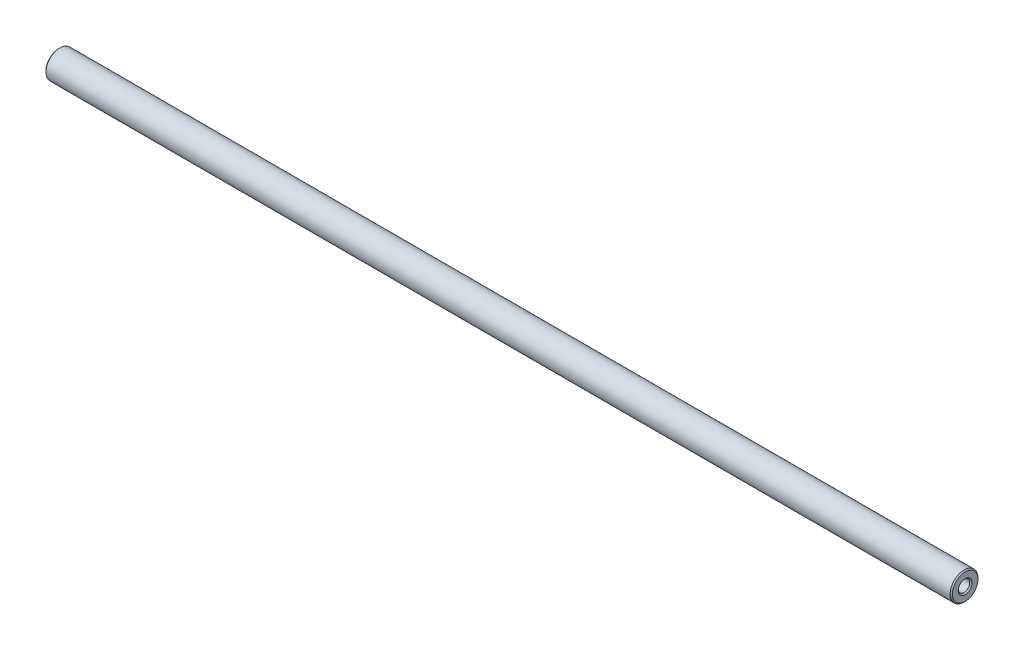
ISO-10303-21;
HEADER;
FILE_DESCRIPTION(('STEP AP214'),'2;1');
FILE_NAME('part.step','',(''),(''),'','','');
FILE_SCHEMA(('AUTOMOTIVE_DESIGN { 1 0 10303 214 1 1 1 1 }'));
ENDSEC;
DATA;
#1=APPLICATION_CONTEXT('core data for automotive mechanical design processes');
#2=APPLICATION_PROTOCOL_DEFINITION('international standard','automotive_design',2000,#1);
#3=PRODUCT_CONTEXT('',#1,'mechanical');
#4=PRODUCT('Part','Part','',(#3));
#5=PRODUCT_RELATED_PRODUCT_CATEGORY('part','',(#4));
#6=PRODUCT_DEFINITION_FORMATION('','',#4);
#7=PRODUCT_DEFINITION_CONTEXT('part definition',#1,'design');
#8=PRODUCT_DEFINITION('design','',#6,#7);
#9=PRODUCT_DEFINITION_SHAPE('','',#8);
#10=(LENGTH_UNIT() NAMED_UNIT(*) SI_UNIT(.MILLI.,.METRE.));
#11=(NAMED_UNIT(*) PLANE_ANGLE_UNIT() SI_UNIT($,.RADIAN.));
#12=(NAMED_UNIT(*) SI_UNIT($,.STERADIAN.) SOLID_ANGLE_UNIT());
#13=UNCERTAINTY_MEASURE_WITH_UNIT(LENGTH_MEASURE(1.E-05),#10,'distance_accuracy_value','');
#14=(GEOMETRIC_REPRESENTATION_CONTEXT(3) GLOBAL_UNCERTAINTY_ASSIGNED_CONTEXT((#13)) GLOBAL_UNIT_ASSIGNED_CONTEXT((#10,
#11,#12)) REPRESENTATION_CONTEXT('',''));
#15=CARTESIAN_POINT('',(0.,0.,0.));
#16=DIRECTION('',(0.,0.,1.));
#17=DIRECTION('',(1.,0.,0.));
#18=AXIS2_PLACEMENT_3D('',#15,#16,#17);
#19=CARTESIAN_POINT('',(0.,-5.5,5.5));
#20=DIRECTION('',(-1.,0.,0.));
#21=DIRECTION('',(0.,1.,0.));
#22=AXIS2_PLACEMENT_3D('',#19,#20,#21);
#23=PLANE('',#22);
#24=CARTESIAN_POINT('',(0.,0.,0.));
#25=DIRECTION('',(-1.,0.,0.));
#26=DIRECTION('',(0.,0.,-1.));
#27=AXIS2_PLACEMENT_3D('',#24,#25,#26);
#28=CIRCLE('',#27,5.5);
#29=CARTESIAN_POINT('',(0.,0.,-5.5));
#30=VERTEX_POINT('',#29);
#31=EDGE_CURVE('E117',#30,#30,#28,.F.);
#32=ORIENTED_EDGE('',*,*,#31,.F.);
#33=EDGE_LOOP('',(#32));
#34=FACE_BOUND('',#33,.T.);
#35=CARTESIAN_POINT('',(0.,0.,0.));
#36=DIRECTION('',(1.,0.,0.));
#37=DIRECTION('',(0.,0.,1.));
#38=AXIS2_PLACEMENT_3D('',#35,#36,#37);
#39=CIRCLE('',#38,3.);
#40=CARTESIAN_POINT('',(0.,0.,3.));
#41=VERTEX_POINT('',#40);
#42=EDGE_CURVE('E79',#41,#41,#39,.T.);
#43=ORIENTED_EDGE('',*,*,#42,.T.);
#44=EDGE_LOOP('',(#43));
#45=FACE_BOUND('',#44,.T.);
#46=ADVANCED_FACE('F16',(#34,#45),#23,.T.);
#47=CARTESIAN_POINT('',(390.,-5.5,-5.5));
#48=DIRECTION('',(1.,0.,0.));
#49=DIRECTION('',(0.,1.,0.));
#50=AXIS2_PLACEMENT_3D('',#47,#48,#49);
#51=PLANE('',#50);
#52=CARTESIAN_POINT('',(390.,0.,0.));
#53=DIRECTION('',(1.,0.,0.));
#54=DIRECTION('',(0.,0.,1.));
#55=AXIS2_PLACEMENT_3D('',#52,#53,#54);
#56=CIRCLE('',#55,5.5);
#57=CARTESIAN_POINT('',(390.,0.,5.5));
#58=VERTEX_POINT('',#57);
#59=EDGE_CURVE('E110',#58,#58,#56,.T.);
#60=ORIENTED_EDGE('',*,*,#59,.T.);
#61=EDGE_LOOP('',(#60));
#62=FACE_BOUND('',#61,.T.);
#63=CARTESIAN_POINT('',(390.,0.,0.));
#64=DIRECTION('',(-1.,0.,0.));
#65=DIRECTION('',(0.,0.,-1.));
#66=AXIS2_PLACEMENT_3D('',#63,#64,#65);
#67=CIRCLE('',#66,3.00000000000007);
#68=CARTESIAN_POINT('',(390.,0.,-3.00000000000007));
#69=VERTEX_POINT('',#68);
#70=EDGE_CURVE('E108',#69,#69,#67,.F.);
#71=ORIENTED_EDGE('',*,*,#70,.F.);
#72=EDGE_LOOP('',(#71));
#73=FACE_BOUND('',#72,.T.);
#74=ADVANCED_FACE('F49',(#62,#73),#51,.T.);
#75=CARTESIAN_POINT('',(0.500000000000002,0.,0.));
#76=DIRECTION('',(1.,0.,0.));
#77=DIRECTION('',(0.,1.92332050626273E-10,1.));
#78=AXIS2_PLACEMENT_3D('',#75,#76,#77);
#79=CONICAL_SURFACE('',#78,6.,0.785398163397448);
#80=CARTESIAN_POINT('',(0.500000000000002,0.,0.));
#81=DIRECTION('',(-1.,0.,0.));
#82=DIRECTION('',(0.,0.,-1.));
#83=AXIS2_PLACEMENT_3D('',#80,#81,#82);
#84=CIRCLE('',#83,6.);
#85=CARTESIAN_POINT('',(0.500000000000002,0.,-6.));
#86=VERTEX_POINT('',#85);
#87=EDGE_CURVE('E90',#86,#86,#84,.F.);
#88=ORIENTED_EDGE('',*,*,#87,.F.);
#89=EDGE_LOOP('',(#88));
#90=FACE_BOUND('',#89,.T.);
#91=ORIENTED_EDGE('',*,*,#31,.T.);
#92=EDGE_LOOP('',(#91));
#93=FACE_BOUND('',#92,.T.);
#94=ADVANCED_FACE('F55',(#90,#93),#79,.T.);
#95=CARTESIAN_POINT('',(390.,0.,0.));
#96=DIRECTION('',(1.,0.,0.));
#97=DIRECTION('',(0.,7.69327835111053E-10,1.));
#98=AXIS2_PLACEMENT_3D('',#95,#96,#97);
#99=CYLINDRICAL_SURFACE('',#98,6.);
#100=CARTESIAN_POINT('',(389.5,0.,0.));
#101=DIRECTION('',(-1.,0.,0.));
#102=DIRECTION('',(0.,0.,-1.));
#103=AXIS2_PLACEMENT_3D('',#100,#101,#102);
#104=CIRCLE('',#103,6.);
#105=CARTESIAN_POINT('',(389.5,0.,-6.));
#106=VERTEX_POINT('',#105);
#107=EDGE_CURVE('E85',#106,#106,#104,.F.);
#108=ORIENTED_EDGE('',*,*,#107,.F.);
#109=EDGE_LOOP('',(#108));
#110=FACE_BOUND('',#109,.T.);
#111=ORIENTED_EDGE('',*,*,#87,.T.);
#112=EDGE_LOOP('',(#111));
#113=FACE_BOUND('',#112,.T.);
#114=ADVANCED_FACE('F63',(#110,#113),#99,.T.);
#115=CARTESIAN_POINT('',(389.5,0.,0.));
#116=DIRECTION('',(-1.,0.,0.));
#117=DIRECTION('',(0.,0.,-1.));
#118=AXIS2_PLACEMENT_3D('',#115,#116,#117);
#119=CONICAL_SURFACE('',#118,6.,0.785398163397447);
#120=ORIENTED_EDGE('',*,*,#59,.F.);
#121=EDGE_LOOP('',(#120));
#122=FACE_BOUND('',#121,.T.);
#123=ORIENTED_EDGE('',*,*,#107,.T.);
#124=EDGE_LOOP('',(#123));
#125=FACE_BOUND('',#124,.T.);
#126=ADVANCED_FACE('F67',(#122,#125),#119,.T.);
#127=CARTESIAN_POINT('',(0.,0.,0.));
#128=DIRECTION('',(-1.,0.,0.));
#129=DIRECTION('',(0.,0.,-1.));
#130=AXIS2_PLACEMENT_3D('',#127,#128,#129);
#131=CONICAL_SURFACE('',#130,3.,0.785398163397448);
#132=ORIENTED_EDGE('',*,*,#42,.F.);
#133=EDGE_LOOP('',(#132));
#134=FACE_BOUND('',#133,.T.);
#135=CARTESIAN_POINT('',(0.541500000000001,0.,0.));
#136=DIRECTION('',(1.,0.,0.));
#137=DIRECTION('',(0.,0.,1.));
#138=AXIS2_PLACEMENT_3D('',#135,#136,#137);
#139=CIRCLE('',#138,2.4585);
#140=CARTESIAN_POINT('',(0.541500000000001,0.,2.4585));
#141=VERTEX_POINT('',#140);
#142=EDGE_CURVE('E82',#141,#141,#139,.T.);
#143=ORIENTED_EDGE('',*,*,#142,.T.);
#144=EDGE_LOOP('',(#143));
#145=FACE_BOUND('',#144,.T.);
#146=ADVANCED_FACE('F44',(#134,#145),#131,.F.);
#147=CARTESIAN_POINT('',(19.,0.,0.));
#148=DIRECTION('',(1.,0.,0.));
#149=DIRECTION('',(0.,0.,1.));
#150=AXIS2_PLACEMENT_3D('',#147,#148,#149);
#151=CYLINDRICAL_SURFACE('',#150,2.4585);
#152=CARTESIAN_POINT('',(17.580584363197,0.,0.));
#153=DIRECTION('',(1.,0.,0.));
#154=DIRECTION('',(0.,0.,1.));
#155=AXIS2_PLACEMENT_3D('',#152,#153,#154);
#156=CIRCLE('',#155,2.4585);
#157=CARTESIAN_POINT('',(17.580584363197,0.,2.4585));
#158=VERTEX_POINT('',#157);
#159=EDGE_CURVE('E84',#158,#158,#156,.T.);
#160=ORIENTED_EDGE('',*,*,#159,.T.);
#161=EDGE_LOOP('',(#160));
#162=FACE_BOUND('',#161,.T.);
#163=ORIENTED_EDGE('',*,*,#142,.F.);
#164=EDGE_LOOP('',(#163));
#165=FACE_BOUND('',#164,.T.);
#166=ADVANCED_FACE('F33',(#162,#165),#151,.F.);
#167=CARTESIAN_POINT('',(17.580584363197,0.,0.));
#168=DIRECTION('',(-1.,0.,0.));
#169=DIRECTION('',(0.,0.,-1.));
#170=AXIS2_PLACEMENT_3D('',#167,#168,#169);
#171=CONICAL_SURFACE('',#170,2.4585,1.0471975511965);
#172=ORIENTED_EDGE('',*,*,#159,.F.);
#173=EDGE_LOOP('',(#172));
#174=FACE_BOUND('',#173,.T.);
#175=CARTESIAN_POINT('',(19.,0.,0.));
#176=VERTEX_POINT('',#175);
#177=VERTEX_LOOP('',#176);
#178=FACE_BOUND('',#177,.T.);
#179=ADVANCED_FACE('F30',(#174,#178),#171,.F.);
#180=CARTESIAN_POINT('',(372.4194156368,0.,0.));
#181=DIRECTION('',(1.,0.,0.));
#182=DIRECTION('',(0.,0.,1.));
#183=AXIS2_PLACEMENT_3D('',#180,#181,#182);
#184=CONICAL_SURFACE('',#183,2.45849999999995,1.04719755119741);
#185=CARTESIAN_POINT('',(372.4194156368,0.,0.));
#186=DIRECTION('',(1.,0.,0.));
#187=DIRECTION('',(0.,0.,1.));
#188=AXIS2_PLACEMENT_3D('',#185,#186,#187);
#189=CIRCLE('',#188,2.45849999999995);
#190=CARTESIAN_POINT('',(372.4194156368,0.,2.45849999999995));
#191=VERTEX_POINT('',#190);
#192=EDGE_CURVE('E24',#191,#191,#189,.T.);
#193=ORIENTED_EDGE('',*,*,#192,.T.);
#194=EDGE_LOOP('',(#193));
#195=FACE_BOUND('',#194,.T.);
#196=CARTESIAN_POINT('',(371.,0.,0.));
#197=VERTEX_POINT('',#196);
#198=VERTEX_LOOP('',#197);
#199=FACE_BOUND('',#198,.T.);
#200=ADVANCED_FACE('F32',(#195,#199),#184,.F.);
#201=CARTESIAN_POINT('',(390.,0.,0.));
#202=DIRECTION('',(1.,0.,0.));
#203=DIRECTION('',(0.,0.,1.));
#204=AXIS2_PLACEMENT_3D('',#201,#202,#203);
#205=CYLINDRICAL_SURFACE('',#204,2.4585);
#206=CARTESIAN_POINT('',(389.4585,0.,0.));
#207=DIRECTION('',(1.,0.,0.));
#208=DIRECTION('',(0.,0.,1.));
#209=AXIS2_PLACEMENT_3D('',#206,#207,#208);
#210=CIRCLE('',#209,2.4585);
#211=CARTESIAN_POINT('',(389.4585,0.,2.4585));
#212=VERTEX_POINT('',#211);
#213=EDGE_CURVE('E10',#212,#212,#210,.T.);
#214=ORIENTED_EDGE('',*,*,#213,.T.);
#215=EDGE_LOOP('',(#214));
#216=FACE_BOUND('',#215,.T.);
#217=ORIENTED_EDGE('',*,*,#192,.F.);
#218=EDGE_LOOP('',(#217));
#219=FACE_BOUND('',#218,.T.);
#220=ADVANCED_FACE('F41',(#216,#219),#205,.F.);
#221=CARTESIAN_POINT('',(390.,0.,0.));
#222=DIRECTION('',(1.,0.,0.));
#223=DIRECTION('',(0.,0.,1.));
#224=AXIS2_PLACEMENT_3D('',#221,#222,#223);
#225=CONICAL_SURFACE('',#224,3.00000000000001,0.785398163397473);
#226=ORIENTED_EDGE('',*,*,#70,.T.);
#227=EDGE_LOOP('',(#226));
#228=FACE_BOUND('',#227,.T.);
#229=ORIENTED_EDGE('',*,*,#213,.F.);
#230=EDGE_LOOP('',(#229));
#231=FACE_BOUND('',#230,.T.);
#232=ADVANCED_FACE('F18',(#228,#231),#225,.F.);
#233=CLOSED_SHELL('',(#46,#74,#94,#114,#126,#146,#166,#179,#200,#220,#232));
#234=MANIFOLD_SOLID_BREP('B1',#233);
#235=ADVANCED_BREP_SHAPE_REPRESENTATION('',(#18,#234),#14);
#236=SHAPE_DEFINITION_REPRESENTATION(#9,#235);
ENDSEC;
END-ISO-10303-21;
